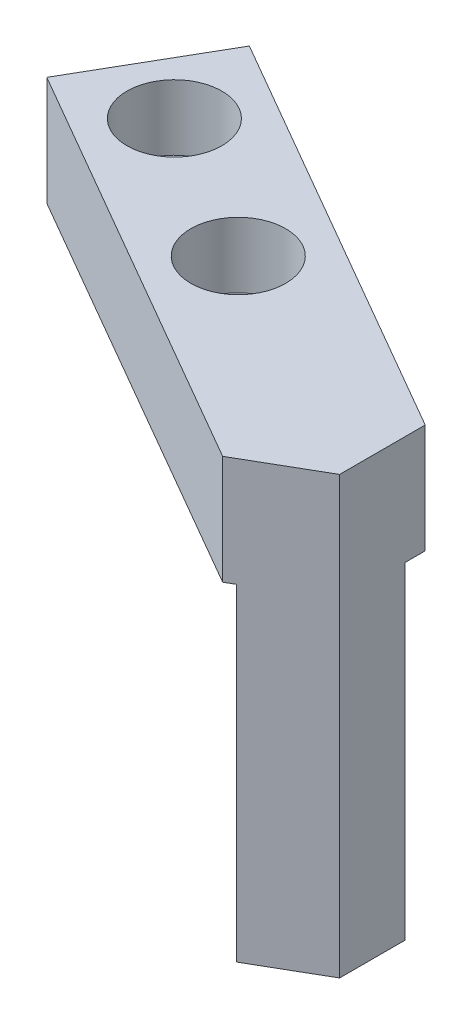
ISO-10303-21;
HEADER;
FILE_DESCRIPTION(('STEP AP214'),'2;1');
FILE_NAME('part.step','',(''),(''),'','','');
FILE_SCHEMA(('AUTOMOTIVE_DESIGN { 1 0 10303 214 1 1 1 1 }'));
ENDSEC;
DATA;
#1=APPLICATION_CONTEXT('core data for automotive mechanical design processes');
#2=APPLICATION_PROTOCOL_DEFINITION('international standard','automotive_design',2000,#1);
#3=PRODUCT_CONTEXT('',#1,'mechanical');
#4=PRODUCT('Part','Part','',(#3));
#5=PRODUCT_RELATED_PRODUCT_CATEGORY('part','',(#4));
#6=PRODUCT_DEFINITION_FORMATION('','',#4);
#7=PRODUCT_DEFINITION_CONTEXT('part definition',#1,'design');
#8=PRODUCT_DEFINITION('design','',#6,#7);
#9=PRODUCT_DEFINITION_SHAPE('','',#8);
#10=(LENGTH_UNIT() NAMED_UNIT(*) SI_UNIT(.MILLI.,.METRE.));
#11=(NAMED_UNIT(*) PLANE_ANGLE_UNIT() SI_UNIT($,.RADIAN.));
#12=(NAMED_UNIT(*) SI_UNIT($,.STERADIAN.) SOLID_ANGLE_UNIT());
#13=UNCERTAINTY_MEASURE_WITH_UNIT(LENGTH_MEASURE(1.E-05),#10,'distance_accuracy_value','');
#14=(GEOMETRIC_REPRESENTATION_CONTEXT(3) GLOBAL_UNCERTAINTY_ASSIGNED_CONTEXT((#13)) GLOBAL_UNIT_ASSIGNED_CONTEXT((#10,
#11,#12)) REPRESENTATION_CONTEXT('',''));
#15=CARTESIAN_POINT('',(0.,0.,0.));
#16=DIRECTION('',(0.,0.,1.));
#17=DIRECTION('',(1.,0.,0.));
#18=AXIS2_PLACEMENT_3D('',#15,#16,#17);
#19=CARTESIAN_POINT('',(0.,-5.,0.));
#20=DIRECTION('',(0.,1.,0.));
#21=DIRECTION('',(0.,0.,1.));
#22=AXIS2_PLACEMENT_3D('',#19,#20,#21);
#23=PLANE('',#22);
#24=CARTESIAN_POINT('',(-10.9985226280624,-5.,-6.34999999999993));
#25=DIRECTION('',(0.,1.,0.));
#26=DIRECTION('',(0.,0.,1.));
#27=AXIS2_PLACEMENT_3D('',#24,#25,#26);
#28=CIRCLE('',#27,1.17500000000001);
#29=CARTESIAN_POINT('',(-10.9985226280624,-5.,-5.17499999999992));
#30=VERTEX_POINT('',#29);
#31=EDGE_CURVE('E39',#30,#30,#28,.T.);
#32=ORIENTED_EDGE('',*,*,#31,.T.);
#33=EDGE_LOOP('',(#32));
#34=FACE_BOUND('',#33,.T.);
#35=CARTESIAN_POINT('',(-17.9267258583379,-5.,-10.35));
#36=DIRECTION('',(0.,1.,0.));
#37=DIRECTION('',(0.,0.,1.));
#38=AXIS2_PLACEMENT_3D('',#35,#36,#37);
#39=CIRCLE('',#38,1.17500000000001);
#40=CARTESIAN_POINT('',(-17.9267258583379,-5.,-9.17499999999999));
#41=VERTEX_POINT('',#40);
#42=EDGE_CURVE('E138',#41,#41,#39,.T.);
#43=ORIENTED_EDGE('',*,*,#42,.T.);
#44=EDGE_LOOP('',(#43));
#45=FACE_BOUND('',#44,.T.);
#46=DIRECTION('',(1.,0.,0.));
#47=VECTOR('',#46,1.);
#48=CARTESIAN_POINT('',(0.,-5.,-2.9979491924311));
#49=LINE('',#48,#47);
#50=CARTESIAN_POINT('',(-3.,-5.,-2.9979491924311));
#51=VERTEX_POINT('',#50);
#52=CARTESIAN_POINT('',(0.,-5.,-2.9979491924311));
#53=VERTEX_POINT('',#52);
#54=EDGE_CURVE('E128',#51,#53,#49,.T.);
#55=ORIENTED_EDGE('',*,*,#54,.F.);
#56=DIRECTION('',(0.,0.,-1.));
#57=VECTOR('',#56,1.);
#58=CARTESIAN_POINT('',(-3.,-5.,-2.9979491924311));
#59=LINE('',#58,#57);
#60=CARTESIAN_POINT('',(-3.,-5.,1.7320508075689));
#61=VERTEX_POINT('',#60);
#62=EDGE_CURVE('E52',#61,#51,#59,.T.);
#63=ORIENTED_EDGE('',*,*,#62,.F.);
#64=DIRECTION('',(-0.866025403784439,0.,0.5));
#65=VECTOR('',#64,1.);
#66=CARTESIAN_POINT('',(0.,-5.,0.));
#67=LINE('',#66,#65);
#68=CARTESIAN_POINT('',(-3.4,-5.,1.96299091524475));
#69=VERTEX_POINT('',#68);
#70=EDGE_CURVE('E161',#61,#69,#67,.T.);
#71=ORIENTED_EDGE('',*,*,#70,.T.);
#72=DIRECTION('',(-0.866025403784442,0.,-0.499999999999995));
#73=VECTOR('',#72,1.);
#74=CARTESIAN_POINT('',(-3.4,-5.,1.96299091524475));
#75=LINE('',#74,#73);
#76=CARTESIAN_POINT('',(-22.4846096908266,-5.,-9.05551362713278));
#77=VERTEX_POINT('',#76);
#78=EDGE_CURVE('E163',#69,#77,#75,.T.);
#79=ORIENTED_EDGE('',*,*,#78,.T.);
#80=DIRECTION('',(0.499999999999998,0.,-0.86602540378444));
#81=VECTOR('',#80,1.);
#82=CARTESIAN_POINT('',(-22.4846096908266,-5.,-9.05551362713278));
#83=LINE('',#82,#81);
#84=CARTESIAN_POINT('',(-19.0846096908266,-5.,-14.944486372867));
#85=VERTEX_POINT('',#84);
#86=EDGE_CURVE('E149',#77,#85,#83,.T.);
#87=ORIENTED_EDGE('',*,*,#86,.T.);
#88=DIRECTION('',(0.866025403784441,0.,0.499999999999996));
#89=VECTOR('',#88,1.);
#90=CARTESIAN_POINT('',(-19.0846096908266,-5.,-14.944486372867));
#91=LINE('',#90,#89);
#92=CARTESIAN_POINT('',(0.,-5.,-3.92598183048944));
#93=VERTEX_POINT('',#92);
#94=EDGE_CURVE('E145',#85,#93,#91,.T.);
#95=ORIENTED_EDGE('',*,*,#94,.T.);
#96=DIRECTION('',(0.,0.,1.));
#97=VECTOR('',#96,1.);
#98=CARTESIAN_POINT('',(0.,-5.,-3.92598183048944));
#99=LINE('',#98,#97);
#100=EDGE_CURVE('E58',#93,#53,#99,.T.);
#101=ORIENTED_EDGE('',*,*,#100,.T.);
#102=EDGE_LOOP('',(#55,#63,#71,#79,#87,#95,#101));
#103=FACE_BOUND('',#102,.T.);
#104=ADVANCED_FACE('F35',(#34,#45,#103),#23,.F.);
#105=CARTESIAN_POINT('',(-19.0846096908266,0.,-14.944486372867));
#106=DIRECTION('',(0.499999999999996,0.,-0.866025403784441));
#107=DIRECTION('',(-0.866025403784441,0.,-0.499999999999996));
#108=AXIS2_PLACEMENT_3D('',#105,#106,#107);
#109=PLANE('',#108);
#110=ORIENTED_EDGE('',*,*,#94,.F.);
#111=DIRECTION('',(0.,-1.,0.));
#112=VECTOR('',#111,1.);
#113=CARTESIAN_POINT('',(-19.0846096908266,0.,-14.944486372867));
#114=LINE('',#113,#112);
#115=CARTESIAN_POINT('',(-19.0846096908266,0.,-14.944486372867));
#116=VERTEX_POINT('',#115);
#117=EDGE_CURVE('E11',#116,#85,#114,.T.);
#118=ORIENTED_EDGE('',*,*,#117,.F.);
#119=DIRECTION('',(0.866025403784441,0.,0.499999999999996));
#120=VECTOR('',#119,1.);
#121=CARTESIAN_POINT('',(-19.0846096908266,0.,-14.944486372867));
#122=LINE('',#121,#120);
#123=CARTESIAN_POINT('',(0.,0.,-3.92598183048944));
#124=VERTEX_POINT('',#123);
#125=EDGE_CURVE('E146',#116,#124,#122,.T.);
#126=ORIENTED_EDGE('',*,*,#125,.T.);
#127=DIRECTION('',(0.,-1.,0.));
#128=VECTOR('',#127,1.);
#129=CARTESIAN_POINT('',(0.,0.,-3.92598183048944));
#130=LINE('',#129,#128);
#131=EDGE_CURVE('E113',#124,#93,#130,.T.);
#132=ORIENTED_EDGE('',*,*,#131,.T.);
#133=EDGE_LOOP('',(#110,#118,#126,#132));
#134=FACE_BOUND('',#133,.T.);
#135=ADVANCED_FACE('F37',(#134),#109,.T.);
#136=CARTESIAN_POINT('',(-22.4846096908266,0.,-9.05551362713278));
#137=DIRECTION('',(-0.86602540378444,0.,-0.499999999999998));
#138=DIRECTION('',(-0.499999999999998,0.,0.86602540378444));
#139=AXIS2_PLACEMENT_3D('',#136,#137,#138);
#140=PLANE('',#139);
#141=ORIENTED_EDGE('',*,*,#86,.F.);
#142=DIRECTION('',(0.,-1.,0.));
#143=VECTOR('',#142,1.);
#144=CARTESIAN_POINT('',(-22.4846096908266,0.,-9.05551362713278));
#145=LINE('',#144,#143);
#146=CARTESIAN_POINT('',(-22.4846096908266,0.,-9.05551362713278));
#147=VERTEX_POINT('',#146);
#148=EDGE_CURVE('E44',#147,#77,#145,.T.);
#149=ORIENTED_EDGE('',*,*,#148,.F.);
#150=DIRECTION('',(0.499999999999998,0.,-0.86602540378444));
#151=VECTOR('',#150,1.);
#152=CARTESIAN_POINT('',(-22.4846096908266,0.,-9.05551362713278));
#153=LINE('',#152,#151);
#154=EDGE_CURVE('E156',#147,#116,#153,.T.);
#155=ORIENTED_EDGE('',*,*,#154,.T.);
#156=ORIENTED_EDGE('',*,*,#117,.T.);
#157=EDGE_LOOP('',(#141,#149,#155,#156));
#158=FACE_BOUND('',#157,.T.);
#159=ADVANCED_FACE('F210',(#158),#140,.T.);
#160=CARTESIAN_POINT('',(-3.4,0.,1.96299091524475));
#161=DIRECTION('',(-0.499999999999995,0.,0.866025403784442));
#162=DIRECTION('',(0.866025403784442,0.,0.499999999999995));
#163=AXIS2_PLACEMENT_3D('',#160,#161,#162);
#164=PLANE('',#163);
#165=ORIENTED_EDGE('',*,*,#78,.F.);
#166=DIRECTION('',(0.,-1.,0.));
#167=VECTOR('',#166,1.);
#168=CARTESIAN_POINT('',(-3.4,0.,1.96299091524475));
#169=LINE('',#168,#167);
#170=CARTESIAN_POINT('',(-3.4,0.,1.96299091524475));
#171=VERTEX_POINT('',#170);
#172=EDGE_CURVE('E112',#171,#69,#169,.T.);
#173=ORIENTED_EDGE('',*,*,#172,.F.);
#174=DIRECTION('',(-0.866025403784442,0.,-0.499999999999995));
#175=VECTOR('',#174,1.);
#176=CARTESIAN_POINT('',(-3.4,0.,1.96299091524475));
#177=LINE('',#176,#175);
#178=EDGE_CURVE('E153',#171,#147,#177,.T.);
#179=ORIENTED_EDGE('',*,*,#178,.T.);
#180=ORIENTED_EDGE('',*,*,#148,.T.);
#181=EDGE_LOOP('',(#165,#173,#179,#180));
#182=FACE_BOUND('',#181,.T.);
#183=ADVANCED_FACE('F214',(#182),#164,.T.);
#184=CARTESIAN_POINT('',(0.,0.,0.));
#185=DIRECTION('',(0.5,0.,0.866025403784439));
#186=DIRECTION('',(0.866025403784439,0.,-0.5));
#187=AXIS2_PLACEMENT_3D('',#184,#185,#186);
#188=PLANE('',#187);
#189=ORIENTED_EDGE('',*,*,#70,.F.);
#190=DIRECTION('',(0.,1.,0.));
#191=VECTOR('',#190,1.);
#192=CARTESIAN_POINT('',(-3.,-20.,1.7320508075689));
#193=LINE('',#192,#191);
#194=CARTESIAN_POINT('',(-3.,-20.,1.7320508075689));
#195=VERTEX_POINT('',#194);
#196=EDGE_CURVE('E119',#195,#61,#193,.T.);
#197=ORIENTED_EDGE('',*,*,#196,.F.);
#198=DIRECTION('',(-0.866025403784439,0.,0.5));
#199=VECTOR('',#198,1.);
#200=CARTESIAN_POINT('',(-3.,-20.,1.7320508075689));
#201=LINE('',#200,#199);
#202=CARTESIAN_POINT('',(0.,-20.,0.));
#203=VERTEX_POINT('',#202);
#204=EDGE_CURVE('E116',#203,#195,#201,.T.);
#205=ORIENTED_EDGE('',*,*,#204,.F.);
#206=DIRECTION('',(0.,-1.,0.));
#207=VECTOR('',#206,1.);
#208=CARTESIAN_POINT('',(0.,0.,0.));
#209=LINE('',#208,#207);
#210=CARTESIAN_POINT('',(0.,0.,0.));
#211=VERTEX_POINT('',#210);
#212=EDGE_CURVE('E101',#211,#203,#209,.T.);
#213=ORIENTED_EDGE('',*,*,#212,.F.);
#214=DIRECTION('',(-0.866025403784439,0.,0.5));
#215=VECTOR('',#214,1.);
#216=CARTESIAN_POINT('',(0.,0.,0.));
#217=LINE('',#216,#215);
#218=EDGE_CURVE('E151',#211,#171,#217,.T.);
#219=ORIENTED_EDGE('',*,*,#218,.T.);
#220=ORIENTED_EDGE('',*,*,#172,.T.);
#221=EDGE_LOOP('',(#189,#197,#205,#213,#219,#220));
#222=FACE_BOUND('',#221,.T.);
#223=ADVANCED_FACE('F117',(#222),#188,.T.);
#224=CARTESIAN_POINT('',(0.,0.,-3.92598183048944));
#225=DIRECTION('',(1.,0.,0.));
#226=DIRECTION('',(0.,0.,-1.));
#227=AXIS2_PLACEMENT_3D('',#224,#225,#226);
#228=PLANE('',#227);
#229=ORIENTED_EDGE('',*,*,#100,.F.);
#230=ORIENTED_EDGE('',*,*,#131,.F.);
#231=DIRECTION('',(0.,0.,1.));
#232=VECTOR('',#231,1.);
#233=CARTESIAN_POINT('',(0.,0.,-3.92598183048944));
#234=LINE('',#233,#232);
#235=EDGE_CURVE('E108',#124,#211,#234,.T.);
#236=ORIENTED_EDGE('',*,*,#235,.T.);
#237=ORIENTED_EDGE('',*,*,#212,.T.);
#238=DIRECTION('',(0.,0.,1.));
#239=VECTOR('',#238,1.);
#240=CARTESIAN_POINT('',(0.,-20.,0.));
#241=LINE('',#240,#239);
#242=CARTESIAN_POINT('',(0.,-20.,-2.9979491924311));
#243=VERTEX_POINT('',#242);
#244=EDGE_CURVE('E106',#243,#203,#241,.T.);
#245=ORIENTED_EDGE('',*,*,#244,.F.);
#246=DIRECTION('',(0.,1.,0.));
#247=VECTOR('',#246,1.);
#248=CARTESIAN_POINT('',(0.,-20.,-2.9979491924311));
#249=LINE('',#248,#247);
#250=EDGE_CURVE('E137',#243,#53,#249,.T.);
#251=ORIENTED_EDGE('',*,*,#250,.T.);
#252=EDGE_LOOP('',(#229,#230,#236,#237,#245,#251));
#253=FACE_BOUND('',#252,.T.);
#254=ADVANCED_FACE('F103',(#253),#228,.T.);
#255=CARTESIAN_POINT('',(0.,0.,0.));
#256=DIRECTION('',(0.,1.,0.));
#257=DIRECTION('',(0.,0.,1.));
#258=AXIS2_PLACEMENT_3D('',#255,#256,#257);
#259=PLANE('',#258);
#260=CARTESIAN_POINT('',(-10.9985226280624,0.,-6.34999999999993));
#261=DIRECTION('',(0.,1.,0.));
#262=DIRECTION('',(0.,0.,1.));
#263=AXIS2_PLACEMENT_3D('',#260,#261,#262);
#264=CIRCLE('',#263,2.17499999999999);
#265=CARTESIAN_POINT('',(-10.9985226280624,0.,-4.17499999999994));
#266=VERTEX_POINT('',#265);
#267=EDGE_CURVE('E191',#266,#266,#264,.T.);
#268=ORIENTED_EDGE('',*,*,#267,.F.);
#269=EDGE_LOOP('',(#268));
#270=FACE_BOUND('',#269,.T.);
#271=CARTESIAN_POINT('',(-17.9267258583379,0.,-10.35));
#272=DIRECTION('',(0.,1.,0.));
#273=DIRECTION('',(0.,0.,1.));
#274=AXIS2_PLACEMENT_3D('',#271,#272,#273);
#275=CIRCLE('',#274,2.17499999999999);
#276=CARTESIAN_POINT('',(-17.9267258583379,0.,-8.17500000000001));
#277=VERTEX_POINT('',#276);
#278=EDGE_CURVE('E179',#277,#277,#275,.T.);
#279=ORIENTED_EDGE('',*,*,#278,.F.);
#280=EDGE_LOOP('',(#279));
#281=FACE_BOUND('',#280,.T.);
#282=ORIENTED_EDGE('',*,*,#125,.F.);
#283=ORIENTED_EDGE('',*,*,#154,.F.);
#284=ORIENTED_EDGE('',*,*,#178,.F.);
#285=ORIENTED_EDGE('',*,*,#218,.F.);
#286=ORIENTED_EDGE('',*,*,#235,.F.);
#287=EDGE_LOOP('',(#282,#283,#284,#285,#286));
#288=FACE_BOUND('',#287,.T.);
#289=ADVANCED_FACE('F197',(#270,#281,#288),#259,.T.);
#290=CARTESIAN_POINT('',(-3.,-20.,-2.9979491924311));
#291=DIRECTION('',(1.,0.,0.));
#292=DIRECTION('',(0.,0.,-1.));
#293=AXIS2_PLACEMENT_3D('',#290,#291,#292);
#294=PLANE('',#293);
#295=ORIENTED_EDGE('',*,*,#62,.T.);
#296=DIRECTION('',(0.,1.,0.));
#297=VECTOR('',#296,1.);
#298=CARTESIAN_POINT('',(-3.,-20.,-2.9979491924311));
#299=LINE('',#298,#297);
#300=CARTESIAN_POINT('',(-3.,-20.,-2.9979491924311));
#301=VERTEX_POINT('',#300);
#302=EDGE_CURVE('E141',#301,#51,#299,.T.);
#303=ORIENTED_EDGE('',*,*,#302,.F.);
#304=DIRECTION('',(0.,0.,-1.));
#305=VECTOR('',#304,1.);
#306=CARTESIAN_POINT('',(-3.,-20.,-2.9979491924311));
#307=LINE('',#306,#305);
#308=EDGE_CURVE('E122',#195,#301,#307,.T.);
#309=ORIENTED_EDGE('',*,*,#308,.F.);
#310=ORIENTED_EDGE('',*,*,#196,.T.);
#311=EDGE_LOOP('',(#295,#303,#309,#310));
#312=FACE_BOUND('',#311,.T.);
#313=ADVANCED_FACE('F200',(#312),#294,.F.);
#314=CARTESIAN_POINT('',(0.,-20.,-2.9979491924311));
#315=DIRECTION('',(0.,0.,1.));
#316=DIRECTION('',(1.,0.,0.));
#317=AXIS2_PLACEMENT_3D('',#314,#315,#316);
#318=PLANE('',#317);
#319=ORIENTED_EDGE('',*,*,#54,.T.);
#320=ORIENTED_EDGE('',*,*,#250,.F.);
#321=DIRECTION('',(1.,0.,0.));
#322=VECTOR('',#321,1.);
#323=CARTESIAN_POINT('',(0.,-20.,-2.9979491924311));
#324=LINE('',#323,#322);
#325=EDGE_CURVE('E126',#301,#243,#324,.T.);
#326=ORIENTED_EDGE('',*,*,#325,.F.);
#327=ORIENTED_EDGE('',*,*,#302,.T.);
#328=EDGE_LOOP('',(#319,#320,#326,#327));
#329=FACE_BOUND('',#328,.T.);
#330=ADVANCED_FACE('F216',(#329),#318,.F.);
#331=CARTESIAN_POINT('',(0.,-20.,0.));
#332=DIRECTION('',(0.,1.,0.));
#333=DIRECTION('',(0.,0.,1.));
#334=AXIS2_PLACEMENT_3D('',#331,#332,#333);
#335=PLANE('',#334);
#336=ORIENTED_EDGE('',*,*,#244,.T.);
#337=ORIENTED_EDGE('',*,*,#204,.T.);
#338=ORIENTED_EDGE('',*,*,#308,.T.);
#339=ORIENTED_EDGE('',*,*,#325,.T.);
#340=EDGE_LOOP('',(#336,#337,#338,#339));
#341=FACE_BOUND('',#340,.T.);
#342=ADVANCED_FACE('F124',(#341),#335,.F.);
#343=CARTESIAN_POINT('',(-17.9267258583379,0.,-10.35));
#344=DIRECTION('',(0.,1.,0.));
#345=DIRECTION('',(0.,0.,1.));
#346=AXIS2_PLACEMENT_3D('',#343,#344,#345);
#347=CYLINDRICAL_SURFACE('',#346,1.17500000000001);
#348=CARTESIAN_POINT('',(-17.9267258583379,-3.,-10.35));
#349=DIRECTION('',(0.,1.,0.));
#350=DIRECTION('',(0.,0.,1.));
#351=AXIS2_PLACEMENT_3D('',#348,#349,#350);
#352=CIRCLE('',#351,1.17500000000001);
#353=CARTESIAN_POINT('',(-17.9267258583379,-3.,-9.17499999999999));
#354=VERTEX_POINT('',#353);
#355=EDGE_CURVE('E132',#354,#354,#352,.T.);
#356=ORIENTED_EDGE('',*,*,#355,.T.);
#357=EDGE_LOOP('',(#356));
#358=FACE_BOUND('',#357,.T.);
#359=ORIENTED_EDGE('',*,*,#42,.F.);
#360=EDGE_LOOP('',(#359));
#361=FACE_BOUND('',#360,.T.);
#362=ADVANCED_FACE('F256',(#358,#361),#347,.F.);
#363=CARTESIAN_POINT('',(-16.7517258583379,-3.,-10.35));
#364=DIRECTION('',(0.,-1.,0.));
#365=DIRECTION('',(0.,0.,-1.));
#366=AXIS2_PLACEMENT_3D('',#363,#364,#365);
#367=PLANE('',#366);
#368=ORIENTED_EDGE('',*,*,#355,.F.);
#369=EDGE_LOOP('',(#368));
#370=FACE_BOUND('',#369,.T.);
#371=CARTESIAN_POINT('',(-17.9267258583379,-3.,-10.35));
#372=DIRECTION('',(0.,1.,0.));
#373=DIRECTION('',(0.,0.,1.));
#374=AXIS2_PLACEMENT_3D('',#371,#372,#373);
#375=CIRCLE('',#374,2.17499999999999);
#376=CARTESIAN_POINT('',(-17.9267258583379,-3.,-8.17500000000001));
#377=VERTEX_POINT('',#376);
#378=EDGE_CURVE('E175',#377,#377,#375,.T.);
#379=ORIENTED_EDGE('',*,*,#378,.T.);
#380=EDGE_LOOP('',(#379));
#381=FACE_BOUND('',#380,.T.);
#382=ADVANCED_FACE('F261',(#370,#381),#367,.F.);
#383=CARTESIAN_POINT('',(-17.9267258583379,0.,-10.35));
#384=DIRECTION('',(0.,1.,0.));
#385=DIRECTION('',(0.,0.,1.));
#386=AXIS2_PLACEMENT_3D('',#383,#384,#385);
#387=CYLINDRICAL_SURFACE('',#386,2.17499999999999);
#388=ORIENTED_EDGE('',*,*,#378,.F.);
#389=EDGE_LOOP('',(#388));
#390=FACE_BOUND('',#389,.T.);
#391=ORIENTED_EDGE('',*,*,#278,.T.);
#392=EDGE_LOOP('',(#391));
#393=FACE_BOUND('',#392,.T.);
#394=ADVANCED_FACE('F272',(#390,#393),#387,.F.);
#395=CARTESIAN_POINT('',(-10.9985226280624,0.,-6.34999999999993));
#396=DIRECTION('',(0.,1.,0.));
#397=DIRECTION('',(0.,0.,1.));
#398=AXIS2_PLACEMENT_3D('',#395,#396,#397);
#399=CYLINDRICAL_SURFACE('',#398,1.17500000000001);
#400=CARTESIAN_POINT('',(-10.9985226280624,-3.,-6.34999999999993));
#401=DIRECTION('',(0.,1.,0.));
#402=DIRECTION('',(0.,0.,1.));
#403=AXIS2_PLACEMENT_3D('',#400,#401,#402);
#404=CIRCLE('',#403,1.17500000000001);
#405=CARTESIAN_POINT('',(-10.9985226280624,-3.,-5.17499999999992));
#406=VERTEX_POINT('',#405);
#407=EDGE_CURVE('E185',#406,#406,#404,.T.);
#408=ORIENTED_EDGE('',*,*,#407,.T.);
#409=EDGE_LOOP('',(#408));
#410=FACE_BOUND('',#409,.T.);
#411=ORIENTED_EDGE('',*,*,#31,.F.);
#412=EDGE_LOOP('',(#411));
#413=FACE_BOUND('',#412,.T.);
#414=ADVANCED_FACE('F282',(#410,#413),#399,.F.);
#415=CARTESIAN_POINT('',(-9.82352262806239,-3.,-6.34999999999993));
#416=DIRECTION('',(0.,-1.,0.));
#417=DIRECTION('',(0.,0.,-1.));
#418=AXIS2_PLACEMENT_3D('',#415,#416,#417);
#419=PLANE('',#418);
#420=ORIENTED_EDGE('',*,*,#407,.F.);
#421=EDGE_LOOP('',(#420));
#422=FACE_BOUND('',#421,.T.);
#423=CARTESIAN_POINT('',(-10.9985226280624,-3.,-6.34999999999993));
#424=DIRECTION('',(0.,1.,0.));
#425=DIRECTION('',(0.,0.,1.));
#426=AXIS2_PLACEMENT_3D('',#423,#424,#425);
#427=CIRCLE('',#426,2.17499999999999);
#428=CARTESIAN_POINT('',(-10.9985226280624,-3.,-4.17499999999994));
#429=VERTEX_POINT('',#428);
#430=EDGE_CURVE('E188',#429,#429,#427,.T.);
#431=ORIENTED_EDGE('',*,*,#430,.T.);
#432=EDGE_LOOP('',(#431));
#433=FACE_BOUND('',#432,.T.);
#434=ADVANCED_FACE('F292',(#422,#433),#419,.F.);
#435=CARTESIAN_POINT('',(-10.9985226280624,0.,-6.34999999999993));
#436=DIRECTION('',(0.,1.,0.));
#437=DIRECTION('',(0.,0.,1.));
#438=AXIS2_PLACEMENT_3D('',#435,#436,#437);
#439=CYLINDRICAL_SURFACE('',#438,2.17499999999999);
#440=ORIENTED_EDGE('',*,*,#430,.F.);
#441=EDGE_LOOP('',(#440));
#442=FACE_BOUND('',#441,.T.);
#443=ORIENTED_EDGE('',*,*,#267,.T.);
#444=EDGE_LOOP('',(#443));
#445=FACE_BOUND('',#444,.T.);
#446=ADVANCED_FACE('F195',(#442,#445),#439,.F.);
#447=CLOSED_SHELL('',(#104,#135,#159,#183,#223,#254,#289,#313,#330,#342,#362,#382,#394,#414,
#434,#446));
#448=MANIFOLD_SOLID_BREP('B2',#447);
#449=ADVANCED_BREP_SHAPE_REPRESENTATION('',(#18,#448),#14);
#450=SHAPE_DEFINITION_REPRESENTATION(#9,#449);
ENDSEC;
END-ISO-10303-21;
